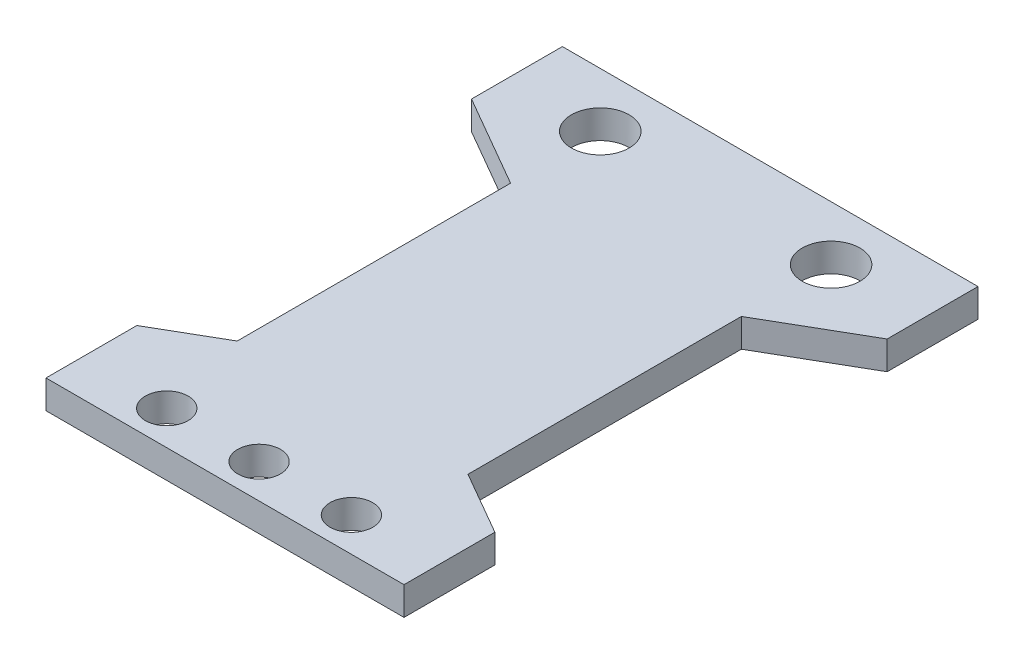
ISO-10303-21;
HEADER;
FILE_DESCRIPTION(('STEP AP214'),'2;1');
FILE_NAME('part.step','',(''),(''),'','','');
FILE_SCHEMA(('AUTOMOTIVE_DESIGN { 1 0 10303 214 1 1 1 1 }'));
ENDSEC;
DATA;
#1=APPLICATION_CONTEXT('core data for automotive mechanical design processes');
#2=APPLICATION_PROTOCOL_DEFINITION('international standard','automotive_design',2000,#1);
#3=PRODUCT_CONTEXT('',#1,'mechanical');
#4=PRODUCT('Part','Part','',(#3));
#5=PRODUCT_RELATED_PRODUCT_CATEGORY('part','',(#4));
#6=PRODUCT_DEFINITION_FORMATION('','',#4);
#7=PRODUCT_DEFINITION_CONTEXT('part definition',#1,'design');
#8=PRODUCT_DEFINITION('design','',#6,#7);
#9=PRODUCT_DEFINITION_SHAPE('','',#8);
#10=(LENGTH_UNIT() NAMED_UNIT(*) SI_UNIT(.MILLI.,.METRE.));
#11=(NAMED_UNIT(*) PLANE_ANGLE_UNIT() SI_UNIT($,.RADIAN.));
#12=(NAMED_UNIT(*) SI_UNIT($,.STERADIAN.) SOLID_ANGLE_UNIT());
#13=UNCERTAINTY_MEASURE_WITH_UNIT(LENGTH_MEASURE(1.E-05),#10,'distance_accuracy_value','');
#14=(GEOMETRIC_REPRESENTATION_CONTEXT(3) GLOBAL_UNCERTAINTY_ASSIGNED_CONTEXT((#13)) GLOBAL_UNIT_ASSIGNED_CONTEXT((#10,
#11,#12)) REPRESENTATION_CONTEXT('',''));
#15=CARTESIAN_POINT('',(0.,0.,0.));
#16=DIRECTION('',(0.,0.,1.));
#17=DIRECTION('',(1.,0.,0.));
#18=AXIS2_PLACEMENT_3D('',#15,#16,#17);
#19=CARTESIAN_POINT('',(45.74,-38.4077991877548,-24.7172008122452));
#20=DIRECTION('',(-0.499999999999998,0.,-0.86602540378444));
#21=DIRECTION('',(-0.86602540378444,0.,0.499999999999998));
#22=AXIS2_PLACEMENT_3D('',#19,#20,#21);
#23=PLANE('',#22);
#24=DIRECTION('',(-0.86602540378444,0.,0.499999999999998));
#25=VECTOR('',#24,1.);
#26=CARTESIAN_POINT('',(45.74,-35.2827991877548,-24.7172008122452));
#27=LINE('',#26,#25);
#28=CARTESIAN_POINT('',(45.74,-35.2827991877548,-24.7172008122452));
#29=VERTEX_POINT('',#28);
#30=CARTESIAN_POINT('',(35.57,-35.2827991877548,-18.8455485745868));
#31=VERTEX_POINT('',#30);
#32=EDGE_CURVE('E51',#29,#31,#27,.T.);
#33=ORIENTED_EDGE('',*,*,#32,.T.);
#34=DIRECTION('',(0.,1.,0.));
#35=VECTOR('',#34,1.);
#36=CARTESIAN_POINT('',(35.57,-38.4077991877548,-18.8455485745867));
#37=LINE('',#36,#35);
#38=CARTESIAN_POINT('',(35.57,-38.4077991877548,-18.8455485745867));
#39=VERTEX_POINT('',#38);
#40=EDGE_CURVE('E12',#39,#31,#37,.T.);
#41=ORIENTED_EDGE('',*,*,#40,.F.);
#42=DIRECTION('',(-0.86602540378444,0.,0.499999999999998));
#43=VECTOR('',#42,1.);
#44=CARTESIAN_POINT('',(45.74,-38.4077991877548,-24.7172008122452));
#45=LINE('',#44,#43);
#46=CARTESIAN_POINT('',(45.74,-38.4077991877548,-24.7172008122452));
#47=VERTEX_POINT('',#46);
#48=EDGE_CURVE('E183',#47,#39,#45,.T.);
#49=ORIENTED_EDGE('',*,*,#48,.F.);
#50=DIRECTION('',(0.,1.,0.));
#51=VECTOR('',#50,1.);
#52=CARTESIAN_POINT('',(45.74,-38.4077991877548,-24.7172008122452));
#53=LINE('',#52,#51);
#54=EDGE_CURVE('E216',#47,#29,#53,.T.);
#55=ORIENTED_EDGE('',*,*,#54,.T.);
#56=EDGE_LOOP('',(#33,#41,#49,#55));
#57=FACE_BOUND('',#56,.T.);
#58=ADVANCED_FACE('F47',(#57),#23,.F.);
#59=CARTESIAN_POINT('',(45.74,-38.4077991877548,-34.7172008122452));
#60=DIRECTION('',(-1.,0.,0.));
#61=DIRECTION('',(0.,1.,0.));
#62=AXIS2_PLACEMENT_3D('',#59,#60,#61);
#63=PLANE('',#62);
#64=DIRECTION('',(0.,0.,1.));
#65=VECTOR('',#64,1.);
#66=CARTESIAN_POINT('',(45.74,-35.2827991877548,-34.7172008122452));
#67=LINE('',#66,#65);
#68=CARTESIAN_POINT('',(45.74,-35.2827991877548,-34.7172008122452));
#69=VERTEX_POINT('',#68);
#70=EDGE_CURVE('E102',#69,#29,#67,.T.);
#71=ORIENTED_EDGE('',*,*,#70,.T.);
#72=ORIENTED_EDGE('',*,*,#54,.F.);
#73=DIRECTION('',(0.,0.,1.));
#74=VECTOR('',#73,1.);
#75=CARTESIAN_POINT('',(45.74,-38.4077991877548,-34.7172008122452));
#76=LINE('',#75,#74);
#77=CARTESIAN_POINT('',(45.74,-38.4077991877548,-34.7172008122452));
#78=VERTEX_POINT('',#77);
#79=EDGE_CURVE('E185',#78,#47,#76,.T.);
#80=ORIENTED_EDGE('',*,*,#79,.F.);
#81=DIRECTION('',(0.,1.,0.));
#82=VECTOR('',#81,1.);
#83=CARTESIAN_POINT('',(45.74,-38.4077991877548,-34.7172008122452));
#84=LINE('',#83,#82);
#85=EDGE_CURVE('E214',#78,#69,#84,.T.);
#86=ORIENTED_EDGE('',*,*,#85,.T.);
#87=EDGE_LOOP('',(#71,#72,#80,#86));
#88=FACE_BOUND('',#87,.T.);
#89=ADVANCED_FACE('F286',(#88),#63,.F.);
#90=CARTESIAN_POINT('',(0.,-38.4077991877548,-34.7172008122452));
#91=DIRECTION('',(0.,0.,1.));
#92=DIRECTION('',(1.,0.,0.));
#93=AXIS2_PLACEMENT_3D('',#90,#91,#92);
#94=PLANE('',#93);
#95=DIRECTION('',(1.,0.,0.));
#96=VECTOR('',#95,1.);
#97=CARTESIAN_POINT('',(0.,-35.2827991877548,-34.7172008122452));
#98=LINE('',#97,#96);
#99=CARTESIAN_POINT('',(0.,-35.2827991877548,-34.7172008122452));
#100=VERTEX_POINT('',#99);
#101=EDGE_CURVE('E212',#100,#69,#98,.T.);
#102=ORIENTED_EDGE('',*,*,#101,.T.);
#103=ORIENTED_EDGE('',*,*,#85,.F.);
#104=DIRECTION('',(1.,0.,0.));
#105=VECTOR('',#104,1.);
#106=CARTESIAN_POINT('',(0.,-38.4077991877548,-34.7172008122452));
#107=LINE('',#106,#105);
#108=CARTESIAN_POINT('',(0.,-38.4077991877548,-34.7172008122452));
#109=VERTEX_POINT('',#108);
#110=EDGE_CURVE('E187',#109,#78,#107,.T.);
#111=ORIENTED_EDGE('',*,*,#110,.F.);
#112=DIRECTION('',(0.,1.,0.));
#113=VECTOR('',#112,1.);
#114=CARTESIAN_POINT('',(0.,-38.4077991877548,-34.7172008122452));
#115=LINE('',#114,#113);
#116=EDGE_CURVE('E210',#109,#100,#115,.T.);
#117=ORIENTED_EDGE('',*,*,#116,.T.);
#118=EDGE_LOOP('',(#102,#103,#111,#117));
#119=FACE_BOUND('',#118,.T.);
#120=ADVANCED_FACE('F288',(#119),#94,.F.);
#121=CARTESIAN_POINT('',(0.,-38.4077991877548,-34.7172008122452));
#122=DIRECTION('',(-1.,0.,0.));
#123=DIRECTION('',(0.,0.,1.));
#124=AXIS2_PLACEMENT_3D('',#121,#122,#123);
#125=PLANE('',#124);
#126=DIRECTION('',(0.,0.,1.));
#127=VECTOR('',#126,1.);
#128=CARTESIAN_POINT('',(0.,-35.2827991877548,-34.7172008122452));
#129=LINE('',#128,#127);
#130=CARTESIAN_POINT('',(0.,-35.2827991877548,-24.7172008122452));
#131=VERTEX_POINT('',#130);
#132=EDGE_CURVE('E176',#100,#131,#129,.T.);
#133=ORIENTED_EDGE('',*,*,#132,.F.);
#134=ORIENTED_EDGE('',*,*,#116,.F.);
#135=DIRECTION('',(0.,0.,1.));
#136=VECTOR('',#135,1.);
#137=CARTESIAN_POINT('',(0.,-38.4077991877548,-34.7172008122452));
#138=LINE('',#137,#136);
#139=CARTESIAN_POINT('',(0.,-38.4077991877548,-24.7172008122452));
#140=VERTEX_POINT('',#139);
#141=EDGE_CURVE('E207',#109,#140,#138,.T.);
#142=ORIENTED_EDGE('',*,*,#141,.T.);
#143=DIRECTION('',(0.,1.,0.));
#144=VECTOR('',#143,1.);
#145=CARTESIAN_POINT('',(0.,-38.4077991877548,-24.7172008122452));
#146=LINE('',#145,#144);
#147=EDGE_CURVE('E205',#140,#131,#146,.T.);
#148=ORIENTED_EDGE('',*,*,#147,.T.);
#149=EDGE_LOOP('',(#133,#134,#142,#148));
#150=FACE_BOUND('',#149,.T.);
#151=ADVANCED_FACE('F294',(#150),#125,.T.);
#152=CARTESIAN_POINT('',(0.,-38.4077991877548,-24.7172008122452));
#153=DIRECTION('',(-0.499999999999998,0.,0.86602540378444));
#154=DIRECTION('',(0.86602540378444,0.,0.499999999999998));
#155=AXIS2_PLACEMENT_3D('',#152,#153,#154);
#156=PLANE('',#155);
#157=DIRECTION('',(0.86602540378444,0.,0.499999999999998));
#158=VECTOR('',#157,1.);
#159=CARTESIAN_POINT('',(0.,-35.2827991877548,-24.7172008122452));
#160=LINE('',#159,#158);
#161=CARTESIAN_POINT('',(10.17,-35.2827991877548,-18.8455485745868));
#162=VERTEX_POINT('',#161);
#163=EDGE_CURVE('E174',#131,#162,#160,.T.);
#164=ORIENTED_EDGE('',*,*,#163,.F.);
#165=ORIENTED_EDGE('',*,*,#147,.F.);
#166=DIRECTION('',(0.86602540378444,0.,0.499999999999998));
#167=VECTOR('',#166,1.);
#168=CARTESIAN_POINT('',(0.,-38.4077991877548,-24.7172008122452));
#169=LINE('',#168,#167);
#170=CARTESIAN_POINT('',(10.17,-38.4077991877548,-18.8455485745867));
#171=VERTEX_POINT('',#170);
#172=EDGE_CURVE('E202',#140,#171,#169,.T.);
#173=ORIENTED_EDGE('',*,*,#172,.T.);
#174=DIRECTION('',(0.,1.,0.));
#175=VECTOR('',#174,1.);
#176=CARTESIAN_POINT('',(10.17,-38.4077991877548,-18.8455485745867));
#177=LINE('',#176,#175);
#178=EDGE_CURVE('E66',#171,#162,#177,.T.);
#179=ORIENTED_EDGE('',*,*,#178,.T.);
#180=EDGE_LOOP('',(#164,#165,#173,#179));
#181=FACE_BOUND('',#180,.T.);
#182=ADVANCED_FACE('F302',(#181),#156,.T.);
#183=CARTESIAN_POINT('',(10.17,-47.388055308824,-28.7172008122452));
#184=DIRECTION('',(0.,1.,0.));
#185=DIRECTION('',(1.,0.,0.));
#186=AXIS2_PLACEMENT_3D('',#183,#184,#185);
#187=CYLINDRICAL_SURFACE('',#186,3.175);
#188=CARTESIAN_POINT('',(10.17,-35.2827991877548,-28.7172008122452));
#189=DIRECTION('',(0.,1.,0.));
#190=DIRECTION('',(1.,0.,0.));
#191=AXIS2_PLACEMENT_3D('',#188,#189,#190);
#192=CIRCLE('',#191,3.175);
#193=CARTESIAN_POINT('',(13.345,-35.2827991877548,-28.7172008122452));
#194=VERTEX_POINT('',#193);
#195=EDGE_CURVE('E198',#194,#194,#192,.T.);
#196=ORIENTED_EDGE('',*,*,#195,.T.);
#197=EDGE_LOOP('',(#196));
#198=FACE_BOUND('',#197,.T.);
#199=CARTESIAN_POINT('',(10.17,-38.4077991877548,-28.7172008122452));
#200=DIRECTION('',(0.,-1.,0.));
#201=DIRECTION('',(-1.,0.,0.));
#202=AXIS2_PLACEMENT_3D('',#199,#200,#201);
#203=CIRCLE('',#202,3.175);
#204=CARTESIAN_POINT('',(6.995,-38.4077991877548,-28.7172008122452));
#205=VERTEX_POINT('',#204);
#206=EDGE_CURVE('E189',#205,#205,#203,.F.);
#207=ORIENTED_EDGE('',*,*,#206,.F.);
#208=EDGE_LOOP('',(#207));
#209=FACE_BOUND('',#208,.T.);
#210=ADVANCED_FACE('F306',(#198,#209),#187,.F.);
#211=CARTESIAN_POINT('',(35.57,-47.388055308824,-28.7172008122452));
#212=DIRECTION('',(0.,1.,0.));
#213=DIRECTION('',(1.,0.,0.));
#214=AXIS2_PLACEMENT_3D('',#211,#212,#213);
#215=CYLINDRICAL_SURFACE('',#214,3.17500000000001);
#216=CARTESIAN_POINT('',(35.57,-35.2827991877548,-28.7172008122452));
#217=DIRECTION('',(0.,1.,0.));
#218=DIRECTION('',(1.,0.,0.));
#219=AXIS2_PLACEMENT_3D('',#216,#217,#218);
#220=CIRCLE('',#219,3.17500000000001);
#221=CARTESIAN_POINT('',(38.745,-35.2827991877548,-28.7172008122452));
#222=VERTEX_POINT('',#221);
#223=EDGE_CURVE('E195',#222,#222,#220,.T.);
#224=ORIENTED_EDGE('',*,*,#223,.T.);
#225=EDGE_LOOP('',(#224));
#226=FACE_BOUND('',#225,.T.);
#227=CARTESIAN_POINT('',(35.57,-38.4077991877548,-28.7172008122452));
#228=DIRECTION('',(0.,-1.,0.));
#229=DIRECTION('',(-1.,0.,0.));
#230=AXIS2_PLACEMENT_3D('',#227,#228,#229);
#231=CIRCLE('',#230,3.17500000000001);
#232=CARTESIAN_POINT('',(32.395,-38.4077991877548,-28.7172008122452));
#233=VERTEX_POINT('',#232);
#234=EDGE_CURVE('E192',#233,#233,#231,.F.);
#235=ORIENTED_EDGE('',*,*,#234,.F.);
#236=EDGE_LOOP('',(#235));
#237=FACE_BOUND('',#236,.T.);
#238=ADVANCED_FACE('F310',(#226,#237),#215,.F.);
#239=CARTESIAN_POINT('',(0.,-38.4077991877548,-34.7172008122452));
#240=DIRECTION('',(0.,-1.,0.));
#241=DIRECTION('',(-1.,0.,0.));
#242=AXIS2_PLACEMENT_3D('',#239,#240,#241);
#243=PLANE('',#242);
#244=ORIENTED_EDGE('',*,*,#234,.T.);
#245=EDGE_LOOP('',(#244));
#246=FACE_BOUND('',#245,.T.);
#247=ORIENTED_EDGE('',*,*,#206,.T.);
#248=EDGE_LOOP('',(#247));
#249=FACE_BOUND('',#248,.T.);
#250=DIRECTION('',(0.,0.,1.));
#251=VECTOR('',#250,1.);
#252=CARTESIAN_POINT('',(35.57,-38.4077991877548,-18.8455485745867));
#253=LINE('',#252,#251);
#254=CARTESIAN_POINT('',(35.57,-38.4077991877547,11.2413473034273));
#255=VERTEX_POINT('',#254);
#256=EDGE_CURVE('E181',#39,#255,#253,.T.);
#257=ORIENTED_EDGE('',*,*,#256,.T.);
#258=DIRECTION('',(-0.86602540378444,0.,-0.499999999999998));
#259=VECTOR('',#258,1.);
#260=CARTESIAN_POINT('',(42.57,-38.4077991877547,15.2827991877547));
#261=LINE('',#260,#259);
#262=CARTESIAN_POINT('',(42.57,-38.4077991877547,15.2827991877547));
#263=VERTEX_POINT('',#262);
#264=EDGE_CURVE('E254',#263,#255,#261,.T.);
#265=ORIENTED_EDGE('',*,*,#264,.F.);
#266=DIRECTION('',(0.,0.,-1.));
#267=VECTOR('',#266,1.);
#268=CARTESIAN_POINT('',(42.57,-38.4077991877547,25.2827991877547));
#269=LINE('',#268,#267);
#270=CARTESIAN_POINT('',(42.57,-38.4077991877547,25.2827991877547));
#271=VERTEX_POINT('',#270);
#272=EDGE_CURVE('E259',#271,#263,#269,.T.);
#273=ORIENTED_EDGE('',*,*,#272,.F.);
#274=DIRECTION('',(-1.,0.,0.));
#275=VECTOR('',#274,1.);
#276=CARTESIAN_POINT('',(10.17,-38.4077991877547,25.2827991877547));
#277=LINE('',#276,#275);
#278=CARTESIAN_POINT('',(3.17000000000001,-38.4077991877547,25.2827991877547));
#279=VERTEX_POINT('',#278);
#280=EDGE_CURVE('E231',#271,#279,#277,.T.);
#281=ORIENTED_EDGE('',*,*,#280,.T.);
#282=DIRECTION('',(0.,0.,-1.));
#283=VECTOR('',#282,1.);
#284=CARTESIAN_POINT('',(3.17000000000001,-38.4077991877547,25.2827991877547));
#285=LINE('',#284,#283);
#286=CARTESIAN_POINT('',(3.17000000000001,-38.4077991877547,15.2827991877547));
#287=VERTEX_POINT('',#286);
#288=EDGE_CURVE('E229',#279,#287,#285,.T.);
#289=ORIENTED_EDGE('',*,*,#288,.T.);
#290=DIRECTION('',(0.86602540378444,0.,-0.499999999999998));
#291=VECTOR('',#290,1.);
#292=CARTESIAN_POINT('',(3.17000000000001,-38.4077991877547,15.2827991877547));
#293=LINE('',#292,#291);
#294=CARTESIAN_POINT('',(10.17,-38.4077991877547,11.2413473034273));
#295=VERTEX_POINT('',#294);
#296=EDGE_CURVE('E166',#287,#295,#293,.T.);
#297=ORIENTED_EDGE('',*,*,#296,.T.);
#298=DIRECTION('',(0.,0.,1.));
#299=VECTOR('',#298,1.);
#300=CARTESIAN_POINT('',(10.17,-38.4077991877548,-18.8455485745867));
#301=LINE('',#300,#299);
#302=EDGE_CURVE('E112',#171,#295,#301,.T.);
#303=ORIENTED_EDGE('',*,*,#302,.F.);
#304=ORIENTED_EDGE('',*,*,#172,.F.);
#305=ORIENTED_EDGE('',*,*,#141,.F.);
#306=ORIENTED_EDGE('',*,*,#110,.T.);
#307=ORIENTED_EDGE('',*,*,#79,.T.);
#308=ORIENTED_EDGE('',*,*,#48,.T.);
#309=EDGE_LOOP('',(#257,#265,#273,#281,#289,#297,#303,#304,#305,#306,#307,#308));
#310=FACE_BOUND('',#309,.T.);
#311=CARTESIAN_POINT('',(33.03,-38.4077991877547,21.5327991877547));
#312=DIRECTION('',(0.,-1.,0.));
#313=DIRECTION('',(-1.,0.,0.));
#314=AXIS2_PLACEMENT_3D('',#311,#312,#313);
#315=CIRCLE('',#314,2.3495);
#316=CARTESIAN_POINT('',(30.6805,-38.4077991877547,21.5327991877547));
#317=VERTEX_POINT('',#316);
#318=EDGE_CURVE('E239',#317,#317,#315,.F.);
#319=ORIENTED_EDGE('',*,*,#318,.T.);
#320=EDGE_LOOP('',(#319));
#321=FACE_BOUND('',#320,.T.);
#322=CARTESIAN_POINT('',(22.87,-38.4077991877547,21.5327991877547));
#323=DIRECTION('',(0.,-1.,0.));
#324=DIRECTION('',(-1.,0.,0.));
#325=AXIS2_PLACEMENT_3D('',#322,#323,#324);
#326=CIRCLE('',#325,2.3495);
#327=CARTESIAN_POINT('',(20.5205,-38.4077991877547,21.5327991877547));
#328=VERTEX_POINT('',#327);
#329=EDGE_CURVE('E236',#328,#328,#326,.F.);
#330=ORIENTED_EDGE('',*,*,#329,.T.);
#331=EDGE_LOOP('',(#330));
#332=FACE_BOUND('',#331,.T.);
#333=CARTESIAN_POINT('',(12.71,-38.4077991877547,21.5327991877547));
#334=DIRECTION('',(0.,-1.,0.));
#335=DIRECTION('',(-1.,0.,0.));
#336=AXIS2_PLACEMENT_3D('',#333,#334,#335);
#337=CIRCLE('',#336,2.3495);
#338=CARTESIAN_POINT('',(10.3605,-38.4077991877547,21.5327991877547));
#339=VERTEX_POINT('',#338);
#340=EDGE_CURVE('E233',#339,#339,#337,.F.);
#341=ORIENTED_EDGE('',*,*,#340,.T.);
#342=EDGE_LOOP('',(#341));
#343=FACE_BOUND('',#342,.T.);
#344=ADVANCED_FACE('F280',(#246,#249,#310,#321,#332,#343),#243,.T.);
#345=CARTESIAN_POINT('',(10.17,-38.4077991877548,-18.8455485745867));
#346=DIRECTION('',(-1.,0.,0.));
#347=DIRECTION('',(0.,1.,0.));
#348=AXIS2_PLACEMENT_3D('',#345,#346,#347);
#349=PLANE('',#348);
#350=ORIENTED_EDGE('',*,*,#302,.T.);
#351=DIRECTION('',(0.,1.,0.));
#352=VECTOR('',#351,1.);
#353=CARTESIAN_POINT('',(10.17,-38.4077991877547,11.2413473034273));
#354=LINE('',#353,#352);
#355=CARTESIAN_POINT('',(10.17,-35.2827991877547,11.2413473034273));
#356=VERTEX_POINT('',#355);
#357=EDGE_CURVE('E218',#295,#356,#354,.T.);
#358=ORIENTED_EDGE('',*,*,#357,.T.);
#359=DIRECTION('',(0.,0.,1.));
#360=VECTOR('',#359,1.);
#361=CARTESIAN_POINT('',(10.17,-35.2827991877548,-18.8455485745868));
#362=LINE('',#361,#360);
#363=EDGE_CURVE('E170',#162,#356,#362,.T.);
#364=ORIENTED_EDGE('',*,*,#363,.F.);
#365=ORIENTED_EDGE('',*,*,#178,.F.);
#366=EDGE_LOOP('',(#350,#358,#364,#365));
#367=FACE_BOUND('',#366,.T.);
#368=ADVANCED_FACE('F317',(#367),#349,.T.);
#369=CARTESIAN_POINT('',(0.,-35.2827991877549,-34.7172008122453));
#370=DIRECTION('',(0.,-1.,0.));
#371=DIRECTION('',(-1.,0.,0.));
#372=AXIS2_PLACEMENT_3D('',#369,#370,#371);
#373=PLANE('',#372);
#374=ORIENTED_EDGE('',*,*,#223,.F.);
#375=EDGE_LOOP('',(#374));
#376=FACE_BOUND('',#375,.T.);
#377=ORIENTED_EDGE('',*,*,#195,.F.);
#378=EDGE_LOOP('',(#377));
#379=FACE_BOUND('',#378,.T.);
#380=ORIENTED_EDGE('',*,*,#363,.T.);
#381=DIRECTION('',(0.86602540378444,0.,-0.499999999999998));
#382=VECTOR('',#381,1.);
#383=CARTESIAN_POINT('',(3.17000000000001,-35.2827991877547,15.2827991877547));
#384=LINE('',#383,#382);
#385=CARTESIAN_POINT('',(3.17000000000001,-35.2827991877547,15.2827991877547));
#386=VERTEX_POINT('',#385);
#387=EDGE_CURVE('E165',#386,#356,#384,.T.);
#388=ORIENTED_EDGE('',*,*,#387,.F.);
#389=DIRECTION('',(0.,0.,-1.));
#390=VECTOR('',#389,1.);
#391=CARTESIAN_POINT('',(3.17000000000001,-35.2827991877547,25.2827991877547));
#392=LINE('',#391,#390);
#393=CARTESIAN_POINT('',(3.17000000000001,-35.2827991877547,25.2827991877547));
#394=VERTEX_POINT('',#393);
#395=EDGE_CURVE('E151',#394,#386,#392,.T.);
#396=ORIENTED_EDGE('',*,*,#395,.F.);
#397=DIRECTION('',(1.,0.,0.));
#398=VECTOR('',#397,1.);
#399=CARTESIAN_POINT('',(35.57,-35.2827991877547,25.2827991877547));
#400=LINE('',#399,#398);
#401=CARTESIAN_POINT('',(42.57,-35.2827991877547,25.2827991877547));
#402=VERTEX_POINT('',#401);
#403=EDGE_CURVE('E145',#394,#402,#400,.T.);
#404=ORIENTED_EDGE('',*,*,#403,.T.);
#405=DIRECTION('',(0.,0.,-1.));
#406=VECTOR('',#405,1.);
#407=CARTESIAN_POINT('',(42.57,-35.2827991877547,25.2827991877547));
#408=LINE('',#407,#406);
#409=CARTESIAN_POINT('',(42.57,-35.2827991877547,15.2827991877547));
#410=VERTEX_POINT('',#409);
#411=EDGE_CURVE('E222',#402,#410,#408,.T.);
#412=ORIENTED_EDGE('',*,*,#411,.T.);
#413=DIRECTION('',(-0.86602540378444,0.,-0.499999999999998));
#414=VECTOR('',#413,1.);
#415=CARTESIAN_POINT('',(42.57,-35.2827991877547,15.2827991877547));
#416=LINE('',#415,#414);
#417=CARTESIAN_POINT('',(35.57,-35.2827991877547,11.2413473034273));
#418=VERTEX_POINT('',#417);
#419=EDGE_CURVE('E219',#410,#418,#416,.T.);
#420=ORIENTED_EDGE('',*,*,#419,.T.);
#421=DIRECTION('',(0.,0.,1.));
#422=VECTOR('',#421,1.);
#423=CARTESIAN_POINT('',(35.57,-35.2827991877548,-18.8455485745868));
#424=LINE('',#423,#422);
#425=EDGE_CURVE('E57',#31,#418,#424,.T.);
#426=ORIENTED_EDGE('',*,*,#425,.F.);
#427=ORIENTED_EDGE('',*,*,#32,.F.);
#428=ORIENTED_EDGE('',*,*,#70,.F.);
#429=ORIENTED_EDGE('',*,*,#101,.F.);
#430=ORIENTED_EDGE('',*,*,#132,.T.);
#431=ORIENTED_EDGE('',*,*,#163,.T.);
#432=EDGE_LOOP('',(#380,#388,#396,#404,#412,#420,#426,#427,#428,#429,#430,#431));
#433=FACE_BOUND('',#432,.T.);
#434=CARTESIAN_POINT('',(33.03,-35.2827991877547,21.5327991877547));
#435=DIRECTION('',(0.,1.,0.));
#436=DIRECTION('',(1.,0.,0.));
#437=AXIS2_PLACEMENT_3D('',#434,#435,#436);
#438=CIRCLE('',#437,2.3495);
#439=CARTESIAN_POINT('',(35.3795,-35.2827991877547,21.5327991877547));
#440=VERTEX_POINT('',#439);
#441=EDGE_CURVE('E242',#440,#440,#438,.T.);
#442=ORIENTED_EDGE('',*,*,#441,.F.);
#443=EDGE_LOOP('',(#442));
#444=FACE_BOUND('',#443,.T.);
#445=CARTESIAN_POINT('',(22.87,-35.2827991877547,21.5327991877547));
#446=DIRECTION('',(0.,1.,0.));
#447=DIRECTION('',(1.,0.,0.));
#448=AXIS2_PLACEMENT_3D('',#445,#446,#447);
#449=CIRCLE('',#448,2.3495);
#450=CARTESIAN_POINT('',(25.2195,-35.2827991877547,21.5327991877547));
#451=VERTEX_POINT('',#450);
#452=EDGE_CURVE('E245',#451,#451,#449,.T.);
#453=ORIENTED_EDGE('',*,*,#452,.F.);
#454=EDGE_LOOP('',(#453));
#455=FACE_BOUND('',#454,.T.);
#456=CARTESIAN_POINT('',(12.71,-35.2827991877547,21.5327991877547));
#457=DIRECTION('',(0.,1.,0.));
#458=DIRECTION('',(1.,0.,0.));
#459=AXIS2_PLACEMENT_3D('',#456,#457,#458);
#460=CIRCLE('',#459,2.3495);
#461=CARTESIAN_POINT('',(15.0595,-35.2827991877547,21.5327991877547));
#462=VERTEX_POINT('',#461);
#463=EDGE_CURVE('E248',#462,#462,#460,.T.);
#464=ORIENTED_EDGE('',*,*,#463,.F.);
#465=EDGE_LOOP('',(#464));
#466=FACE_BOUND('',#465,.T.);
#467=ADVANCED_FACE('F49',(#376,#379,#433,#444,#455,#466),#373,.F.);
#468=CARTESIAN_POINT('',(35.57,-38.4077991877548,-18.8455485745867));
#469=DIRECTION('',(-1.,0.,0.));
#470=DIRECTION('',(0.,1.,0.));
#471=AXIS2_PLACEMENT_3D('',#468,#469,#470);
#472=PLANE('',#471);
#473=ORIENTED_EDGE('',*,*,#425,.T.);
#474=DIRECTION('',(0.,1.,0.));
#475=VECTOR('',#474,1.);
#476=CARTESIAN_POINT('',(35.57,-38.4077991877547,11.2413473034273));
#477=LINE('',#476,#475);
#478=EDGE_CURVE('E251',#255,#418,#477,.T.);
#479=ORIENTED_EDGE('',*,*,#478,.F.);
#480=ORIENTED_EDGE('',*,*,#256,.F.);
#481=ORIENTED_EDGE('',*,*,#40,.T.);
#482=EDGE_LOOP('',(#473,#479,#480,#481));
#483=FACE_BOUND('',#482,.T.);
#484=ADVANCED_FACE('F278',(#483),#472,.F.);
#485=CARTESIAN_POINT('',(3.17000000000001,-38.4077991877547,15.2827991877547));
#486=DIRECTION('',(0.499999999999998,0.,0.86602540378444));
#487=DIRECTION('',(0.86602540378444,0.,-0.499999999999998));
#488=AXIS2_PLACEMENT_3D('',#485,#486,#487);
#489=PLANE('',#488);
#490=ORIENTED_EDGE('',*,*,#387,.T.);
#491=ORIENTED_EDGE('',*,*,#357,.F.);
#492=ORIENTED_EDGE('',*,*,#296,.F.);
#493=DIRECTION('',(0.,1.,0.));
#494=VECTOR('',#493,1.);
#495=CARTESIAN_POINT('',(3.17000000000001,-38.4077991877547,15.2827991877547));
#496=LINE('',#495,#494);
#497=EDGE_CURVE('E155',#287,#386,#496,.T.);
#498=ORIENTED_EDGE('',*,*,#497,.T.);
#499=EDGE_LOOP('',(#490,#491,#492,#498));
#500=FACE_BOUND('',#499,.T.);
#501=ADVANCED_FACE('F163',(#500),#489,.F.);
#502=CARTESIAN_POINT('',(3.17000000000001,-38.4077991877547,25.2827991877547));
#503=DIRECTION('',(1.,0.,0.));
#504=DIRECTION('',(0.,-1.,0.));
#505=AXIS2_PLACEMENT_3D('',#502,#503,#504);
#506=PLANE('',#505);
#507=ORIENTED_EDGE('',*,*,#395,.T.);
#508=ORIENTED_EDGE('',*,*,#497,.F.);
#509=ORIENTED_EDGE('',*,*,#288,.F.);
#510=DIRECTION('',(0.,1.,0.));
#511=VECTOR('',#510,1.);
#512=CARTESIAN_POINT('',(3.17000000000001,-38.4077991877547,25.2827991877547));
#513=LINE('',#512,#511);
#514=EDGE_CURVE('E157',#279,#394,#513,.T.);
#515=ORIENTED_EDGE('',*,*,#514,.T.);
#516=EDGE_LOOP('',(#507,#508,#509,#515));
#517=FACE_BOUND('',#516,.T.);
#518=ADVANCED_FACE('F153',(#517),#506,.F.);
#519=CARTESIAN_POINT('',(35.57,-38.4077991877547,25.2827991877547));
#520=DIRECTION('',(0.,0.,1.));
#521=DIRECTION('',(1.,0.,0.));
#522=AXIS2_PLACEMENT_3D('',#519,#520,#521);
#523=PLANE('',#522);
#524=ORIENTED_EDGE('',*,*,#403,.F.);
#525=ORIENTED_EDGE('',*,*,#514,.F.);
#526=ORIENTED_EDGE('',*,*,#280,.F.);
#527=DIRECTION('',(0.,1.,0.));
#528=VECTOR('',#527,1.);
#529=CARTESIAN_POINT('',(42.57,-38.4077991877547,25.2827991877547));
#530=LINE('',#529,#528);
#531=EDGE_CURVE('E262',#271,#402,#530,.T.);
#532=ORIENTED_EDGE('',*,*,#531,.T.);
#533=EDGE_LOOP('',(#524,#525,#526,#532));
#534=FACE_BOUND('',#533,.T.);
#535=ADVANCED_FACE('F266',(#534),#523,.T.);
#536=CARTESIAN_POINT('',(42.57,-38.4077991877547,25.2827991877547));
#537=DIRECTION('',(1.,0.,0.));
#538=DIRECTION('',(0.,0.,-1.));
#539=AXIS2_PLACEMENT_3D('',#536,#537,#538);
#540=PLANE('',#539);
#541=ORIENTED_EDGE('',*,*,#411,.F.);
#542=ORIENTED_EDGE('',*,*,#531,.F.);
#543=ORIENTED_EDGE('',*,*,#272,.T.);
#544=DIRECTION('',(0.,1.,0.));
#545=VECTOR('',#544,1.);
#546=CARTESIAN_POINT('',(42.57,-38.4077991877547,15.2827991877547));
#547=LINE('',#546,#545);
#548=EDGE_CURVE('E257',#263,#410,#547,.T.);
#549=ORIENTED_EDGE('',*,*,#548,.T.);
#550=EDGE_LOOP('',(#541,#542,#543,#549));
#551=FACE_BOUND('',#550,.T.);
#552=ADVANCED_FACE('F269',(#551),#540,.T.);
#553=CARTESIAN_POINT('',(42.57,-38.4077991877547,15.2827991877547));
#554=DIRECTION('',(0.499999999999998,0.,-0.86602540378444));
#555=DIRECTION('',(-0.86602540378444,0.,-0.499999999999998));
#556=AXIS2_PLACEMENT_3D('',#553,#554,#555);
#557=PLANE('',#556);
#558=ORIENTED_EDGE('',*,*,#419,.F.);
#559=ORIENTED_EDGE('',*,*,#548,.F.);
#560=ORIENTED_EDGE('',*,*,#264,.T.);
#561=ORIENTED_EDGE('',*,*,#478,.T.);
#562=EDGE_LOOP('',(#558,#559,#560,#561));
#563=FACE_BOUND('',#562,.T.);
#564=ADVANCED_FACE('F273',(#563),#557,.T.);
#565=CARTESIAN_POINT('',(12.71,-47.3880553088238,21.5327991877547));
#566=DIRECTION('',(0.,1.,0.));
#567=DIRECTION('',(1.,0.,0.));
#568=AXIS2_PLACEMENT_3D('',#565,#566,#567);
#569=CYLINDRICAL_SURFACE('',#568,2.3495);
#570=ORIENTED_EDGE('',*,*,#463,.T.);
#571=EDGE_LOOP('',(#570));
#572=FACE_BOUND('',#571,.T.);
#573=ORIENTED_EDGE('',*,*,#340,.F.);
#574=EDGE_LOOP('',(#573));
#575=FACE_BOUND('',#574,.T.);
#576=ADVANCED_FACE('F492',(#572,#575),#569,.F.);
#577=CARTESIAN_POINT('',(22.87,-47.3880553088238,21.5327991877547));
#578=DIRECTION('',(0.,1.,0.));
#579=DIRECTION('',(1.,0.,0.));
#580=AXIS2_PLACEMENT_3D('',#577,#578,#579);
#581=CYLINDRICAL_SURFACE('',#580,2.3495);
#582=ORIENTED_EDGE('',*,*,#452,.T.);
#583=EDGE_LOOP('',(#582));
#584=FACE_BOUND('',#583,.T.);
#585=ORIENTED_EDGE('',*,*,#329,.F.);
#586=EDGE_LOOP('',(#585));
#587=FACE_BOUND('',#586,.T.);
#588=ADVANCED_FACE('F503',(#584,#587),#581,.F.);
#589=CARTESIAN_POINT('',(33.03,-47.3880553088238,21.5327991877547));
#590=DIRECTION('',(0.,1.,0.));
#591=DIRECTION('',(1.,0.,0.));
#592=AXIS2_PLACEMENT_3D('',#589,#590,#591);
#593=CYLINDRICAL_SURFACE('',#592,2.3495);
#594=ORIENTED_EDGE('',*,*,#441,.T.);
#595=EDGE_LOOP('',(#594));
#596=FACE_BOUND('',#595,.T.);
#597=ORIENTED_EDGE('',*,*,#318,.F.);
#598=EDGE_LOOP('',(#597));
#599=FACE_BOUND('',#598,.T.);
#600=ADVANCED_FACE('F515',(#596,#599),#593,.F.);
#601=CLOSED_SHELL('',(#58,#89,#120,#151,#182,#210,#238,#344,#368,#467,#484,#501,#518,#535,#552,
#564,#576,#588,#600));
#602=MANIFOLD_SOLID_BREP('B2',#601);
#603=ADVANCED_BREP_SHAPE_REPRESENTATION('',(#18,#602),#14);
#604=SHAPE_DEFINITION_REPRESENTATION(#9,#603);
ENDSEC;
END-ISO-10303-21;
